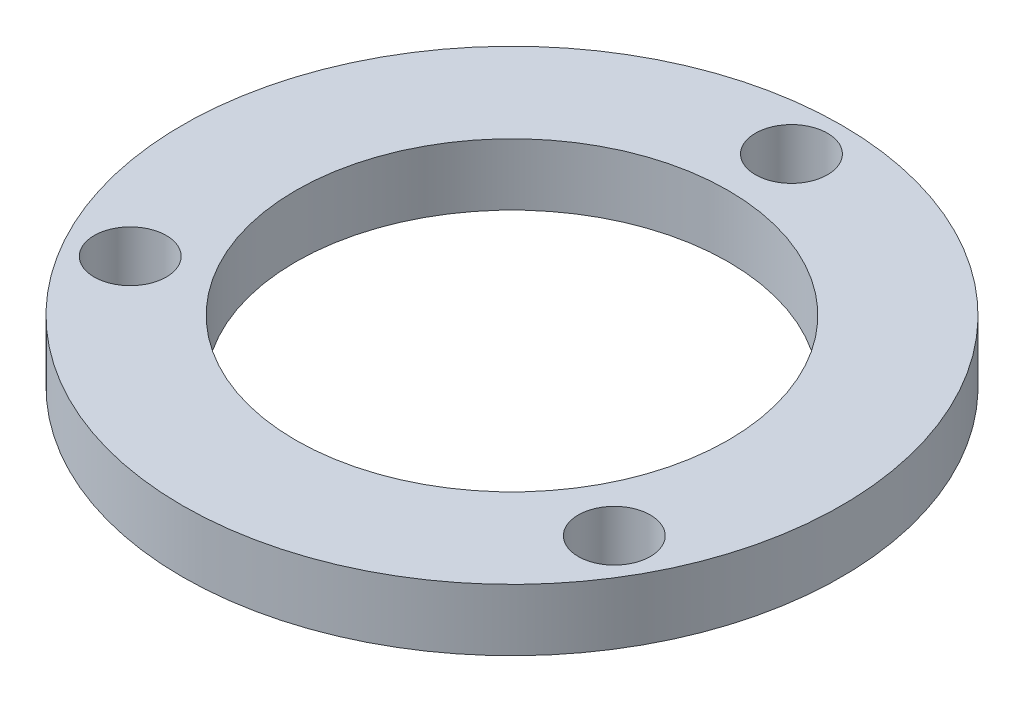
ISO-10303-21;
HEADER;
FILE_DESCRIPTION(('STEP AP214'),'2;1');
FILE_NAME('part.step','',(''),(''),'','','');
FILE_SCHEMA(('AUTOMOTIVE_DESIGN { 1 0 10303 214 1 1 1 1 }'));
ENDSEC;
DATA;
#1=APPLICATION_CONTEXT('core data for automotive mechanical design processes');
#2=APPLICATION_PROTOCOL_DEFINITION('international standard','automotive_design',2000,#1);
#3=PRODUCT_CONTEXT('',#1,'mechanical');
#4=PRODUCT('Part','Part','',(#3));
#5=PRODUCT_RELATED_PRODUCT_CATEGORY('part','',(#4));
#6=PRODUCT_DEFINITION_FORMATION('','',#4);
#7=PRODUCT_DEFINITION_CONTEXT('part definition',#1,'design');
#8=PRODUCT_DEFINITION('design','',#6,#7);
#9=PRODUCT_DEFINITION_SHAPE('','',#8);
#10=(LENGTH_UNIT() NAMED_UNIT(*) SI_UNIT(.MILLI.,.METRE.));
#11=(NAMED_UNIT(*) PLANE_ANGLE_UNIT() SI_UNIT($,.RADIAN.));
#12=(NAMED_UNIT(*) SI_UNIT($,.STERADIAN.) SOLID_ANGLE_UNIT());
#13=UNCERTAINTY_MEASURE_WITH_UNIT(LENGTH_MEASURE(1.E-05),#10,'distance_accuracy_value','');
#14=(GEOMETRIC_REPRESENTATION_CONTEXT(3) GLOBAL_UNCERTAINTY_ASSIGNED_CONTEXT((#13)) GLOBAL_UNIT_ASSIGNED_CONTEXT((#10,
#11,#12)) REPRESENTATION_CONTEXT('',''));
#15=CARTESIAN_POINT('',(0.,0.,0.));
#16=DIRECTION('',(0.,0.,1.));
#17=DIRECTION('',(1.,0.,0.));
#18=AXIS2_PLACEMENT_3D('',#15,#16,#17);
#19=CARTESIAN_POINT('',(0.,3.,0.));
#20=DIRECTION('',(0.,1.,0.));
#21=DIRECTION('',(0.,0.,1.));
#22=AXIS2_PLACEMENT_3D('',#19,#20,#21);
#23=PLANE('',#22);
#24=CARTESIAN_POINT('',(0.,3.,-13.5677313259562));
#25=DIRECTION('',(0.,1.,0.));
#26=DIRECTION('',(0.,0.,1.));
#27=AXIS2_PLACEMENT_3D('',#24,#25,#26);
#28=CIRCLE('',#27,1.75);
#29=CARTESIAN_POINT('',(0.,3.,-11.8177313259562));
#30=VERTEX_POINT('',#29);
#31=EDGE_CURVE('E62',#30,#30,#28,.T.);
#32=ORIENTED_EDGE('',*,*,#31,.F.);
#33=EDGE_LOOP('',(#32));
#34=FACE_BOUND('',#33,.T.);
#35=CARTESIAN_POINT('',(-11.75,3.,6.7838656629781));
#36=DIRECTION('',(0.,1.,0.));
#37=DIRECTION('',(0.,0.,1.));
#38=AXIS2_PLACEMENT_3D('',#35,#36,#37);
#39=CIRCLE('',#38,1.75);
#40=CARTESIAN_POINT('',(-11.75,3.,8.5338656629781));
#41=VERTEX_POINT('',#40);
#42=EDGE_CURVE('E56',#41,#41,#39,.T.);
#43=ORIENTED_EDGE('',*,*,#42,.F.);
#44=EDGE_LOOP('',(#43));
#45=FACE_BOUND('',#44,.T.);
#46=CARTESIAN_POINT('',(11.75,3.,6.7838656629781));
#47=DIRECTION('',(0.,1.,0.));
#48=DIRECTION('',(0.,0.,1.));
#49=AXIS2_PLACEMENT_3D('',#46,#47,#48);
#50=CIRCLE('',#49,1.75);
#51=CARTESIAN_POINT('',(11.75,3.,8.5338656629781));
#52=VERTEX_POINT('',#51);
#53=EDGE_CURVE('E50',#52,#52,#50,.T.);
#54=ORIENTED_EDGE('',*,*,#53,.F.);
#55=EDGE_LOOP('',(#54));
#56=FACE_BOUND('',#55,.T.);
#57=CARTESIAN_POINT('',(0.,3.,0.));
#58=DIRECTION('',(0.,1.,0.));
#59=DIRECTION('',(0.,0.,1.));
#60=AXIS2_PLACEMENT_3D('',#57,#58,#59);
#61=CIRCLE('',#60,16.);
#62=CARTESIAN_POINT('',(0.,3.,16.));
#63=VERTEX_POINT('',#62);
#64=EDGE_CURVE('E10',#63,#63,#61,.T.);
#65=ORIENTED_EDGE('',*,*,#64,.T.);
#66=EDGE_LOOP('',(#65));
#67=FACE_BOUND('',#66,.T.);
#68=CARTESIAN_POINT('',(0.,3.,0.));
#69=DIRECTION('',(0.,1.,0.));
#70=DIRECTION('',(0.,0.,1.));
#71=AXIS2_PLACEMENT_3D('',#68,#69,#70);
#72=CIRCLE('',#71,10.5);
#73=CARTESIAN_POINT('',(0.,3.,10.5));
#74=VERTEX_POINT('',#73);
#75=EDGE_CURVE('E42',#74,#74,#72,.T.);
#76=ORIENTED_EDGE('',*,*,#75,.F.);
#77=EDGE_LOOP('',(#76));
#78=FACE_BOUND('',#77,.T.);
#79=ADVANCED_FACE('F31',(#34,#45,#56,#67,#78),#23,.T.);
#80=CARTESIAN_POINT('',(0.,0.,0.));
#81=DIRECTION('',(0.,1.,0.));
#82=DIRECTION('',(0.,0.,1.));
#83=AXIS2_PLACEMENT_3D('',#80,#81,#82);
#84=PLANE('',#83);
#85=CARTESIAN_POINT('',(0.,0.,-13.5677313259562));
#86=DIRECTION('',(0.,1.,0.));
#87=DIRECTION('',(0.,0.,1.));
#88=AXIS2_PLACEMENT_3D('',#85,#86,#87);
#89=CIRCLE('',#88,1.75);
#90=CARTESIAN_POINT('',(0.,0.,-11.8177313259562));
#91=VERTEX_POINT('',#90);
#92=EDGE_CURVE('E47',#91,#91,#89,.T.);
#93=ORIENTED_EDGE('',*,*,#92,.T.);
#94=EDGE_LOOP('',(#93));
#95=FACE_BOUND('',#94,.T.);
#96=CARTESIAN_POINT('',(-11.75,0.,6.7838656629781));
#97=DIRECTION('',(0.,1.,0.));
#98=DIRECTION('',(0.,0.,1.));
#99=AXIS2_PLACEMENT_3D('',#96,#97,#98);
#100=CIRCLE('',#99,1.75);
#101=CARTESIAN_POINT('',(-11.75,0.,8.5338656629781));
#102=VERTEX_POINT('',#101);
#103=EDGE_CURVE('E59',#102,#102,#100,.T.);
#104=ORIENTED_EDGE('',*,*,#103,.T.);
#105=EDGE_LOOP('',(#104));
#106=FACE_BOUND('',#105,.T.);
#107=CARTESIAN_POINT('',(11.75,0.,6.7838656629781));
#108=DIRECTION('',(0.,1.,0.));
#109=DIRECTION('',(0.,0.,1.));
#110=AXIS2_PLACEMENT_3D('',#107,#108,#109);
#111=CIRCLE('',#110,1.75);
#112=CARTESIAN_POINT('',(11.75,0.,8.5338656629781));
#113=VERTEX_POINT('',#112);
#114=EDGE_CURVE('E53',#113,#113,#111,.T.);
#115=ORIENTED_EDGE('',*,*,#114,.T.);
#116=EDGE_LOOP('',(#115));
#117=FACE_BOUND('',#116,.T.);
#118=CARTESIAN_POINT('',(0.,0.,0.));
#119=DIRECTION('',(0.,1.,0.));
#120=DIRECTION('',(0.,0.,1.));
#121=AXIS2_PLACEMENT_3D('',#118,#119,#120);
#122=CIRCLE('',#121,16.);
#123=CARTESIAN_POINT('',(0.,0.,16.));
#124=VERTEX_POINT('',#123);
#125=EDGE_CURVE('E35',#124,#124,#122,.T.);
#126=ORIENTED_EDGE('',*,*,#125,.F.);
#127=EDGE_LOOP('',(#126));
#128=FACE_BOUND('',#127,.T.);
#129=CARTESIAN_POINT('',(0.,0.,0.));
#130=DIRECTION('',(0.,1.,0.));
#131=DIRECTION('',(0.,0.,1.));
#132=AXIS2_PLACEMENT_3D('',#129,#130,#131);
#133=CIRCLE('',#132,10.5);
#134=CARTESIAN_POINT('',(0.,0.,10.5));
#135=VERTEX_POINT('',#134);
#136=EDGE_CURVE('E44',#135,#135,#133,.T.);
#137=ORIENTED_EDGE('',*,*,#136,.T.);
#138=EDGE_LOOP('',(#137));
#139=FACE_BOUND('',#138,.T.);
#140=ADVANCED_FACE('F68',(#95,#106,#117,#128,#139),#84,.F.);
#141=CARTESIAN_POINT('',(0.,3.,0.));
#142=DIRECTION('',(0.,-1.,0.));
#143=DIRECTION('',(0.,0.,-1.));
#144=AXIS2_PLACEMENT_3D('',#141,#142,#143);
#145=CYLINDRICAL_SURFACE('',#144,16.);
#146=ORIENTED_EDGE('',*,*,#64,.F.);
#147=EDGE_LOOP('',(#146));
#148=FACE_BOUND('',#147,.T.);
#149=ORIENTED_EDGE('',*,*,#125,.T.);
#150=EDGE_LOOP('',(#149));
#151=FACE_BOUND('',#150,.T.);
#152=ADVANCED_FACE('F33',(#148,#151),#145,.T.);
#153=CARTESIAN_POINT('',(0.,3.,0.));
#154=DIRECTION('',(0.,-1.,0.));
#155=DIRECTION('',(0.,0.,-1.));
#156=AXIS2_PLACEMENT_3D('',#153,#154,#155);
#157=CYLINDRICAL_SURFACE('',#156,10.5);
#158=ORIENTED_EDGE('',*,*,#75,.T.);
#159=EDGE_LOOP('',(#158));
#160=FACE_BOUND('',#159,.T.);
#161=ORIENTED_EDGE('',*,*,#136,.F.);
#162=EDGE_LOOP('',(#161));
#163=FACE_BOUND('',#162,.T.);
#164=ADVANCED_FACE('F87',(#160,#163),#157,.F.);
#165=CARTESIAN_POINT('',(11.75,0.,6.7838656629781));
#166=DIRECTION('',(0.,1.,0.));
#167=DIRECTION('',(0.,0.,1.));
#168=AXIS2_PLACEMENT_3D('',#165,#166,#167);
#169=CYLINDRICAL_SURFACE('',#168,1.75);
#170=ORIENTED_EDGE('',*,*,#114,.F.);
#171=EDGE_LOOP('',(#170));
#172=FACE_BOUND('',#171,.T.);
#173=ORIENTED_EDGE('',*,*,#53,.T.);
#174=EDGE_LOOP('',(#173));
#175=FACE_BOUND('',#174,.T.);
#176=ADVANCED_FACE('F90',(#172,#175),#169,.F.);
#177=CARTESIAN_POINT('',(-11.75,0.,6.7838656629781));
#178=DIRECTION('',(0.,1.,0.));
#179=DIRECTION('',(0.,0.,1.));
#180=AXIS2_PLACEMENT_3D('',#177,#178,#179);
#181=CYLINDRICAL_SURFACE('',#180,1.75);
#182=ORIENTED_EDGE('',*,*,#103,.F.);
#183=EDGE_LOOP('',(#182));
#184=FACE_BOUND('',#183,.T.);
#185=ORIENTED_EDGE('',*,*,#42,.T.);
#186=EDGE_LOOP('',(#185));
#187=FACE_BOUND('',#186,.T.);
#188=ADVANCED_FACE('F74',(#184,#187),#181,.F.);
#189=CARTESIAN_POINT('',(0.,0.,-13.5677313259562));
#190=DIRECTION('',(0.,1.,0.));
#191=DIRECTION('',(0.,0.,1.));
#192=AXIS2_PLACEMENT_3D('',#189,#190,#191);
#193=CYLINDRICAL_SURFACE('',#192,1.75);
#194=ORIENTED_EDGE('',*,*,#92,.F.);
#195=EDGE_LOOP('',(#194));
#196=FACE_BOUND('',#195,.T.);
#197=ORIENTED_EDGE('',*,*,#31,.T.);
#198=EDGE_LOOP('',(#197));
#199=FACE_BOUND('',#198,.T.);
#200=ADVANCED_FACE('F71',(#196,#199),#193,.F.);
#201=CLOSED_SHELL('',(#79,#140,#152,#164,#176,#188,#200));
#202=MANIFOLD_SOLID_BREP('B2',#201);
#203=ADVANCED_BREP_SHAPE_REPRESENTATION('',(#18,#202),#14);
#204=SHAPE_DEFINITION_REPRESENTATION(#9,#203);
ENDSEC;
END-ISO-10303-21;
